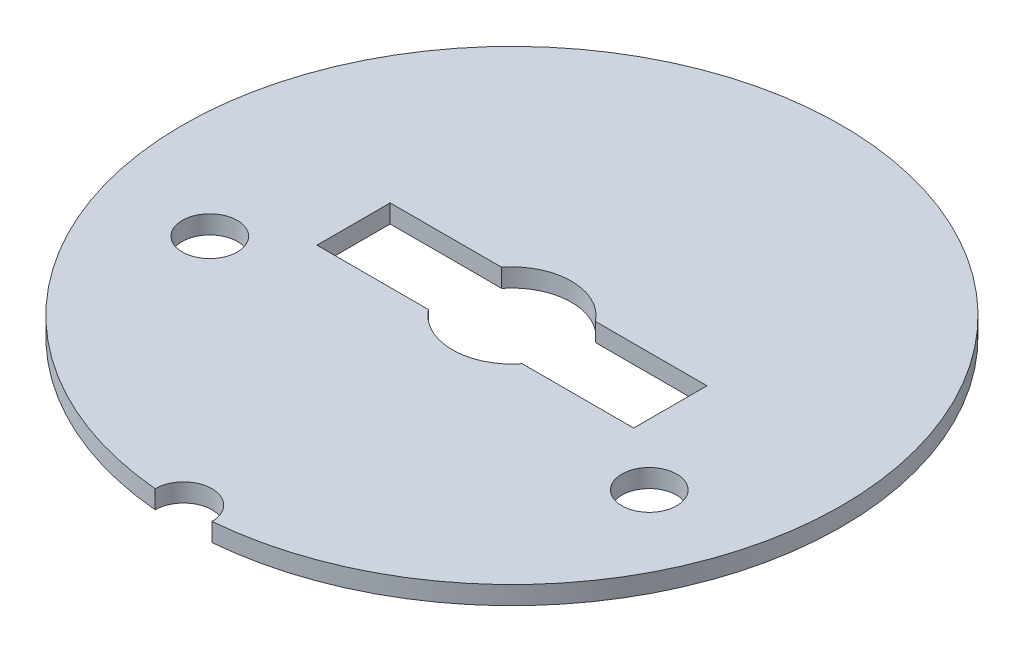
ISO-10303-21;
HEADER;
FILE_DESCRIPTION(('STEP AP214'),'2;1');
FILE_NAME('part.step','',(''),(''),'','','');
FILE_SCHEMA(('AUTOMOTIVE_DESIGN { 1 0 10303 214 1 1 1 1 }'));
ENDSEC;
DATA;
#1=APPLICATION_CONTEXT('core data for automotive mechanical design processes');
#2=APPLICATION_PROTOCOL_DEFINITION('international standard','automotive_design',2000,#1);
#3=PRODUCT_CONTEXT('',#1,'mechanical');
#4=PRODUCT('Part','Part','',(#3));
#5=PRODUCT_RELATED_PRODUCT_CATEGORY('part','',(#4));
#6=PRODUCT_DEFINITION_FORMATION('','',#4);
#7=PRODUCT_DEFINITION_CONTEXT('part definition',#1,'design');
#8=PRODUCT_DEFINITION('design','',#6,#7);
#9=PRODUCT_DEFINITION_SHAPE('','',#8);
#10=(LENGTH_UNIT() NAMED_UNIT(*) SI_UNIT(.MILLI.,.METRE.));
#11=(NAMED_UNIT(*) PLANE_ANGLE_UNIT() SI_UNIT($,.RADIAN.));
#12=(NAMED_UNIT(*) SI_UNIT($,.STERADIAN.) SOLID_ANGLE_UNIT());
#13=UNCERTAINTY_MEASURE_WITH_UNIT(LENGTH_MEASURE(1.E-05),#10,'distance_accuracy_value','');
#14=(GEOMETRIC_REPRESENTATION_CONTEXT(3) GLOBAL_UNCERTAINTY_ASSIGNED_CONTEXT((#13)) GLOBAL_UNIT_ASSIGNED_CONTEXT((#10,
#11,#12)) REPRESENTATION_CONTEXT('',''));
#15=CARTESIAN_POINT('',(0.,0.,0.));
#16=DIRECTION('',(0.,0.,1.));
#17=DIRECTION('',(1.,0.,0.));
#18=AXIS2_PLACEMENT_3D('',#15,#16,#17);
#19=CARTESIAN_POINT('',(0.,20.32,22.7750874367147));
#20=DIRECTION('',(0.,1.,0.));
#21=DIRECTION('',(0.,0.,1.));
#22=AXIS2_PLACEMENT_3D('',#19,#20,#21);
#23=PLANE('',#22);
#24=CARTESIAN_POINT('',(-30.48,20.32,11.43));
#25=DIRECTION('',(0.,1.,0.));
#26=DIRECTION('',(0.,0.,1.));
#27=AXIS2_PLACEMENT_3D('',#24,#25,#26);
#28=CIRCLE('',#27,3.81);
#29=CARTESIAN_POINT('',(-30.48,20.32,15.24));
#30=VERTEX_POINT('',#29);
#31=EDGE_CURVE('E130',#30,#30,#28,.F.);
#32=ORIENTED_EDGE('',*,*,#31,.T.);
#33=EDGE_LOOP('',(#32));
#34=FACE_BOUND('',#33,.T.);
#35=CARTESIAN_POINT('',(30.48,20.32,11.43));
#36=DIRECTION('',(0.,1.,0.));
#37=DIRECTION('',(0.,0.,1.));
#38=AXIS2_PLACEMENT_3D('',#35,#36,#37);
#39=CIRCLE('',#38,3.81);
#40=CARTESIAN_POINT('',(30.48,20.32,15.24));
#41=VERTEX_POINT('',#40);
#42=EDGE_CURVE('E153',#41,#41,#39,.F.);
#43=ORIENTED_EDGE('',*,*,#42,.T.);
#44=EDGE_LOOP('',(#43));
#45=FACE_BOUND('',#44,.T.);
#46=CARTESIAN_POINT('',(0.,20.32,45.5501748734294));
#47=DIRECTION('',(0.,-1.,0.));
#48=DIRECTION('',(0.,0.,1.));
#49=AXIS2_PLACEMENT_3D('',#46,#47,#48);
#50=CIRCLE('',#49,3.937);
#51=CARTESIAN_POINT('',(-3.93700000000001,20.32,45.5501748734294));
#52=VERTEX_POINT('',#51);
#53=CARTESIAN_POINT('',(3.937,20.32,45.5501748734294));
#54=VERTEX_POINT('',#53);
#55=EDGE_CURVE('E197',#52,#54,#50,.T.);
#56=ORIENTED_EDGE('',*,*,#55,.T.);
#57=CARTESIAN_POINT('',(0.,20.32,0.));
#58=DIRECTION('',(0.,1.,0.));
#59=DIRECTION('',(0.,0.,1.));
#60=AXIS2_PLACEMENT_3D('',#57,#58,#59);
#61=CIRCLE('',#60,45.72);
#62=EDGE_CURVE('E133',#54,#52,#61,.T.);
#63=ORIENTED_EDGE('',*,*,#62,.T.);
#64=EDGE_LOOP('',(#56,#63));
#65=FACE_BOUND('',#64,.T.);
#66=CARTESIAN_POINT('',(0.,20.32,0.));
#67=DIRECTION('',(0.,1.,0.));
#68=DIRECTION('',(0.,0.,1.));
#69=AXIS2_PLACEMENT_3D('',#66,#67,#68);
#70=CIRCLE('',#69,8.255);
#71=CARTESIAN_POINT('',(-6.50681373638434,20.32,-5.08));
#72=VERTEX_POINT('',#71);
#73=CARTESIAN_POINT('',(6.50681373638434,20.32,-5.08));
#74=VERTEX_POINT('',#73);
#75=EDGE_CURVE('E145',#72,#74,#70,.F.);
#76=ORIENTED_EDGE('',*,*,#75,.T.);
#77=DIRECTION('',(1.,0.,0.));
#78=VECTOR('',#77,1.);
#79=CARTESIAN_POINT('',(0.,20.32,-5.08));
#80=LINE('',#79,#78);
#81=CARTESIAN_POINT('',(21.971,20.32,-5.08));
#82=VERTEX_POINT('',#81);
#83=EDGE_CURVE('E188',#74,#82,#80,.T.);
#84=ORIENTED_EDGE('',*,*,#83,.T.);
#85=DIRECTION('',(0.,0.,1.));
#86=VECTOR('',#85,1.);
#87=CARTESIAN_POINT('',(21.971,20.32,22.7750874367147));
#88=LINE('',#87,#86);
#89=CARTESIAN_POINT('',(21.971,20.32,5.08));
#90=VERTEX_POINT('',#89);
#91=EDGE_CURVE('E148',#82,#90,#88,.T.);
#92=ORIENTED_EDGE('',*,*,#91,.T.);
#93=DIRECTION('',(-1.,0.,0.));
#94=VECTOR('',#93,1.);
#95=CARTESIAN_POINT('',(0.,20.32,5.08));
#96=LINE('',#95,#94);
#97=CARTESIAN_POINT('',(6.50681373638434,20.32,5.08));
#98=VERTEX_POINT('',#97);
#99=EDGE_CURVE('E179',#90,#98,#96,.T.);
#100=ORIENTED_EDGE('',*,*,#99,.T.);
#101=CARTESIAN_POINT('',(-6.50681373638434,20.32,5.08));
#102=VERTEX_POINT('',#101);
#103=EDGE_CURVE('E123',#98,#102,#70,.F.);
#104=ORIENTED_EDGE('',*,*,#103,.T.);
#105=CARTESIAN_POINT('',(-21.971,20.32,5.08));
#106=VERTEX_POINT('',#105);
#107=EDGE_CURVE('E175',#102,#106,#96,.T.);
#108=ORIENTED_EDGE('',*,*,#107,.T.);
#109=DIRECTION('',(0.,0.,-1.));
#110=VECTOR('',#109,1.);
#111=CARTESIAN_POINT('',(-21.971,20.32,22.7750874367147));
#112=LINE('',#111,#110);
#113=CARTESIAN_POINT('',(-21.971,20.32,-5.08));
#114=VERTEX_POINT('',#113);
#115=EDGE_CURVE('E182',#106,#114,#112,.T.);
#116=ORIENTED_EDGE('',*,*,#115,.T.);
#117=EDGE_CURVE('E192',#114,#72,#80,.T.);
#118=ORIENTED_EDGE('',*,*,#117,.T.);
#119=EDGE_LOOP('',(#76,#84,#92,#100,#104,#108,#116,#118));
#120=FACE_BOUND('',#119,.T.);
#121=ADVANCED_FACE('F35',(#34,#45,#65,#120),#23,.T.);
#122=CARTESIAN_POINT('',(21.971,38.608,5.08));
#123=DIRECTION('',(-1.,0.,0.));
#124=DIRECTION('',(0.,0.,1.));
#125=AXIS2_PLACEMENT_3D('',#122,#123,#124);
#126=PLANE('',#125);
#127=DIRECTION('',(0.,-1.,0.));
#128=VECTOR('',#127,1.);
#129=CARTESIAN_POINT('',(21.971,38.608,-5.08));
#130=LINE('',#129,#128);
#131=CARTESIAN_POINT('',(21.971,17.78,-5.08));
#132=VERTEX_POINT('',#131);
#133=EDGE_CURVE('E171',#82,#132,#130,.T.);
#134=ORIENTED_EDGE('',*,*,#133,.T.);
#135=DIRECTION('',(0.,0.,1.));
#136=VECTOR('',#135,1.);
#137=CARTESIAN_POINT('',(21.971,17.78,0.));
#138=LINE('',#137,#136);
#139=CARTESIAN_POINT('',(21.971,17.78,5.08));
#140=VERTEX_POINT('',#139);
#141=EDGE_CURVE('E44',#132,#140,#138,.T.);
#142=ORIENTED_EDGE('',*,*,#141,.T.);
#143=DIRECTION('',(0.,-1.,0.));
#144=VECTOR('',#143,1.);
#145=CARTESIAN_POINT('',(21.971,38.608,5.08));
#146=LINE('',#145,#144);
#147=EDGE_CURVE('E53',#90,#140,#146,.T.);
#148=ORIENTED_EDGE('',*,*,#147,.F.);
#149=ORIENTED_EDGE('',*,*,#91,.F.);
#150=EDGE_LOOP('',(#134,#142,#148,#149));
#151=FACE_BOUND('',#150,.T.);
#152=ADVANCED_FACE('F201',(#151),#126,.T.);
#153=CARTESIAN_POINT('',(-21.971,38.608,5.08));
#154=DIRECTION('',(0.,0.,-1.));
#155=DIRECTION('',(-1.,0.,0.));
#156=AXIS2_PLACEMENT_3D('',#153,#154,#155);
#157=PLANE('',#156);
#158=ORIENTED_EDGE('',*,*,#147,.T.);
#159=DIRECTION('',(-1.,0.,0.));
#160=VECTOR('',#159,1.);
#161=CARTESIAN_POINT('',(0.,17.78,5.08));
#162=LINE('',#161,#160);
#163=CARTESIAN_POINT('',(6.50681373638435,17.78,5.08));
#164=VERTEX_POINT('',#163);
#165=EDGE_CURVE('E139',#140,#164,#162,.T.);
#166=ORIENTED_EDGE('',*,*,#165,.T.);
#167=DIRECTION('',(0.,-1.,0.));
#168=VECTOR('',#167,1.);
#169=CARTESIAN_POINT('',(6.50681373638434,50.038,5.08));
#170=LINE('',#169,#168);
#171=EDGE_CURVE('E178',#98,#164,#170,.T.);
#172=ORIENTED_EDGE('',*,*,#171,.F.);
#173=ORIENTED_EDGE('',*,*,#99,.F.);
#174=EDGE_LOOP('',(#158,#166,#172,#173));
#175=FACE_BOUND('',#174,.T.);
#176=ADVANCED_FACE('F251',(#175),#157,.T.);
#177=CARTESIAN_POINT('',(0.,50.038,0.));
#178=DIRECTION('',(0.,-1.,0.));
#179=DIRECTION('',(0.,0.,-1.));
#180=AXIS2_PLACEMENT_3D('',#177,#178,#179);
#181=CYLINDRICAL_SURFACE('',#180,8.255);
#182=ORIENTED_EDGE('',*,*,#103,.F.);
#183=ORIENTED_EDGE('',*,*,#171,.T.);
#184=CARTESIAN_POINT('',(0.,17.78,0.));
#185=DIRECTION('',(0.,1.,0.));
#186=DIRECTION('',(0.,0.,1.));
#187=AXIS2_PLACEMENT_3D('',#184,#185,#186);
#188=CIRCLE('',#187,8.255);
#189=CARTESIAN_POINT('',(-6.50681373638435,17.78,5.08));
#190=VERTEX_POINT('',#189);
#191=EDGE_CURVE('E146',#190,#164,#188,.T.);
#192=ORIENTED_EDGE('',*,*,#191,.F.);
#193=DIRECTION('',(0.,-1.,0.));
#194=VECTOR('',#193,1.);
#195=CARTESIAN_POINT('',(-6.50681373638434,50.038,5.08));
#196=LINE('',#195,#194);
#197=EDGE_CURVE('E61',#190,#102,#196,.F.);
#198=ORIENTED_EDGE('',*,*,#197,.T.);
#199=EDGE_LOOP('',(#182,#183,#192,#198));
#200=FACE_BOUND('',#199,.T.);
#201=ADVANCED_FACE('F222',(#200),#181,.F.);
#202=ORIENTED_EDGE('',*,*,#197,.F.);
#203=CARTESIAN_POINT('',(-21.971,17.78,5.08));
#204=VERTEX_POINT('',#203);
#205=EDGE_CURVE('E135',#190,#204,#162,.T.);
#206=ORIENTED_EDGE('',*,*,#205,.T.);
#207=DIRECTION('',(0.,-1.,0.));
#208=VECTOR('',#207,1.);
#209=CARTESIAN_POINT('',(-21.971,38.608,5.08));
#210=LINE('',#209,#208);
#211=EDGE_CURVE('E165',#106,#204,#210,.T.);
#212=ORIENTED_EDGE('',*,*,#211,.F.);
#213=ORIENTED_EDGE('',*,*,#107,.F.);
#214=EDGE_LOOP('',(#202,#206,#212,#213));
#215=FACE_BOUND('',#214,.T.);
#216=ADVANCED_FACE('F226',(#215),#157,.T.);
#217=CARTESIAN_POINT('',(-21.971,38.608,5.08));
#218=DIRECTION('',(1.,0.,0.));
#219=DIRECTION('',(0.,0.,-1.));
#220=AXIS2_PLACEMENT_3D('',#217,#218,#219);
#221=PLANE('',#220);
#222=ORIENTED_EDGE('',*,*,#211,.T.);
#223=DIRECTION('',(0.,0.,-1.));
#224=VECTOR('',#223,1.);
#225=CARTESIAN_POINT('',(-21.971,17.78,0.));
#226=LINE('',#225,#224);
#227=CARTESIAN_POINT('',(-21.971,17.78,-5.08));
#228=VERTEX_POINT('',#227);
#229=EDGE_CURVE('E137',#204,#228,#226,.T.);
#230=ORIENTED_EDGE('',*,*,#229,.T.);
#231=DIRECTION('',(0.,-1.,0.));
#232=VECTOR('',#231,1.);
#233=CARTESIAN_POINT('',(-21.971,38.608,-5.08));
#234=LINE('',#233,#232);
#235=EDGE_CURVE('E168',#114,#228,#234,.T.);
#236=ORIENTED_EDGE('',*,*,#235,.F.);
#237=ORIENTED_EDGE('',*,*,#115,.F.);
#238=EDGE_LOOP('',(#222,#230,#236,#237));
#239=FACE_BOUND('',#238,.T.);
#240=ADVANCED_FACE('F228',(#239),#221,.T.);
#241=CARTESIAN_POINT('',(-21.971,38.608,-5.08));
#242=DIRECTION('',(0.,0.,1.));
#243=DIRECTION('',(1.,0.,0.));
#244=AXIS2_PLACEMENT_3D('',#241,#242,#243);
#245=PLANE('',#244);
#246=ORIENTED_EDGE('',*,*,#235,.T.);
#247=DIRECTION('',(1.,0.,0.));
#248=VECTOR('',#247,1.);
#249=CARTESIAN_POINT('',(0.,17.78,-5.08));
#250=LINE('',#249,#248);
#251=CARTESIAN_POINT('',(-6.50681373638434,17.78,-5.08));
#252=VERTEX_POINT('',#251);
#253=EDGE_CURVE('E46',#228,#252,#250,.T.);
#254=ORIENTED_EDGE('',*,*,#253,.T.);
#255=DIRECTION('',(0.,-1.,0.));
#256=VECTOR('',#255,1.);
#257=CARTESIAN_POINT('',(-6.50681373638434,50.038,-5.08));
#258=LINE('',#257,#256);
#259=EDGE_CURVE('E191',#72,#252,#258,.T.);
#260=ORIENTED_EDGE('',*,*,#259,.F.);
#261=ORIENTED_EDGE('',*,*,#117,.F.);
#262=EDGE_LOOP('',(#246,#254,#260,#261));
#263=FACE_BOUND('',#262,.T.);
#264=ADVANCED_FACE('F231',(#263),#245,.T.);
#265=ORIENTED_EDGE('',*,*,#75,.F.);
#266=ORIENTED_EDGE('',*,*,#259,.T.);
#267=CARTESIAN_POINT('',(6.50681373638434,17.78,-5.08));
#268=VERTEX_POINT('',#267);
#269=EDGE_CURVE('E124',#268,#252,#188,.T.);
#270=ORIENTED_EDGE('',*,*,#269,.F.);
#271=DIRECTION('',(0.,-1.,0.));
#272=VECTOR('',#271,1.);
#273=CARTESIAN_POINT('',(6.50681373638434,50.038,-5.08));
#274=LINE('',#273,#272);
#275=EDGE_CURVE('E185',#268,#74,#274,.F.);
#276=ORIENTED_EDGE('',*,*,#275,.T.);
#277=EDGE_LOOP('',(#265,#266,#270,#276));
#278=FACE_BOUND('',#277,.T.);
#279=ADVANCED_FACE('F208',(#278),#181,.F.);
#280=ORIENTED_EDGE('',*,*,#275,.F.);
#281=EDGE_CURVE('E11',#268,#132,#250,.T.);
#282=ORIENTED_EDGE('',*,*,#281,.T.);
#283=ORIENTED_EDGE('',*,*,#133,.F.);
#284=ORIENTED_EDGE('',*,*,#83,.F.);
#285=EDGE_LOOP('',(#280,#282,#283,#284));
#286=FACE_BOUND('',#285,.T.);
#287=ADVANCED_FACE('F213',(#286),#245,.T.);
#288=CARTESIAN_POINT('',(0.,20.32,0.));
#289=DIRECTION('',(0.,-1.,0.));
#290=DIRECTION('',(0.,0.,-1.));
#291=AXIS2_PLACEMENT_3D('',#288,#289,#290);
#292=CYLINDRICAL_SURFACE('',#291,45.72);
#293=CARTESIAN_POINT('',(0.,17.78,0.));
#294=DIRECTION('',(0.,-1.,0.));
#295=DIRECTION('',(0.,0.,-1.));
#296=AXIS2_PLACEMENT_3D('',#293,#294,#295);
#297=CIRCLE('',#296,45.72);
#298=CARTESIAN_POINT('',(-3.937,17.78,45.5501748734294));
#299=VERTEX_POINT('',#298);
#300=CARTESIAN_POINT('',(3.937,17.78,45.5501748734294));
#301=VERTEX_POINT('',#300);
#302=EDGE_CURVE('E126',#299,#301,#297,.T.);
#303=ORIENTED_EDGE('',*,*,#302,.F.);
#304=DIRECTION('',(0.,-1.,0.));
#305=VECTOR('',#304,1.);
#306=CARTESIAN_POINT('',(-3.93700000000001,20.32,45.5501748734294));
#307=LINE('',#306,#305);
#308=EDGE_CURVE('E120',#52,#299,#307,.T.);
#309=ORIENTED_EDGE('',*,*,#308,.F.);
#310=ORIENTED_EDGE('',*,*,#62,.F.);
#311=DIRECTION('',(0.,-1.,0.));
#312=VECTOR('',#311,1.);
#313=CARTESIAN_POINT('',(3.937,20.32,45.5501748734294));
#314=LINE('',#313,#312);
#315=EDGE_CURVE('E118',#54,#301,#314,.T.);
#316=ORIENTED_EDGE('',*,*,#315,.T.);
#317=EDGE_LOOP('',(#303,#309,#310,#316));
#318=FACE_BOUND('',#317,.T.);
#319=ADVANCED_FACE('F132',(#318),#292,.T.);
#320=CARTESIAN_POINT('',(0.,17.78,0.));
#321=DIRECTION('',(0.,1.,0.));
#322=DIRECTION('',(0.,0.,1.));
#323=AXIS2_PLACEMENT_3D('',#320,#321,#322);
#324=PLANE('',#323);
#325=CARTESIAN_POINT('',(-30.48,17.78,11.43));
#326=DIRECTION('',(0.,1.,0.));
#327=DIRECTION('',(0.,0.,1.));
#328=AXIS2_PLACEMENT_3D('',#325,#326,#327);
#329=CIRCLE('',#328,3.81);
#330=CARTESIAN_POINT('',(-30.48,17.78,15.24));
#331=VERTEX_POINT('',#330);
#332=EDGE_CURVE('E39',#331,#331,#329,.F.);
#333=ORIENTED_EDGE('',*,*,#332,.F.);
#334=EDGE_LOOP('',(#333));
#335=FACE_BOUND('',#334,.T.);
#336=CARTESIAN_POINT('',(30.48,17.78,11.43));
#337=DIRECTION('',(0.,1.,0.));
#338=DIRECTION('',(0.,0.,1.));
#339=AXIS2_PLACEMENT_3D('',#336,#337,#338);
#340=CIRCLE('',#339,3.81);
#341=CARTESIAN_POINT('',(30.48,17.78,15.24));
#342=VERTEX_POINT('',#341);
#343=EDGE_CURVE('E151',#342,#342,#340,.F.);
#344=ORIENTED_EDGE('',*,*,#343,.F.);
#345=EDGE_LOOP('',(#344));
#346=FACE_BOUND('',#345,.T.);
#347=CARTESIAN_POINT('',(0.,17.78,45.5501748734294));
#348=DIRECTION('',(0.,1.,0.));
#349=DIRECTION('',(0.,0.,1.));
#350=AXIS2_PLACEMENT_3D('',#347,#348,#349);
#351=CIRCLE('',#350,3.937);
#352=EDGE_CURVE('E114',#299,#301,#351,.F.);
#353=ORIENTED_EDGE('',*,*,#352,.F.);
#354=ORIENTED_EDGE('',*,*,#302,.T.);
#355=EDGE_LOOP('',(#353,#354));
#356=FACE_BOUND('',#355,.T.);
#357=ORIENTED_EDGE('',*,*,#281,.F.);
#358=ORIENTED_EDGE('',*,*,#269,.T.);
#359=ORIENTED_EDGE('',*,*,#253,.F.);
#360=ORIENTED_EDGE('',*,*,#229,.F.);
#361=ORIENTED_EDGE('',*,*,#205,.F.);
#362=ORIENTED_EDGE('',*,*,#191,.T.);
#363=ORIENTED_EDGE('',*,*,#165,.F.);
#364=ORIENTED_EDGE('',*,*,#141,.F.);
#365=EDGE_LOOP('',(#357,#358,#359,#360,#361,#362,#363,#364));
#366=FACE_BOUND('',#365,.T.);
#367=ADVANCED_FACE('F127',(#335,#346,#356,#366),#324,.F.);
#368=CARTESIAN_POINT('',(0.,20.32,45.5501748734294));
#369=DIRECTION('',(0.,-1.,0.));
#370=DIRECTION('',(0.,0.,-1.));
#371=AXIS2_PLACEMENT_3D('',#368,#369,#370);
#372=CYLINDRICAL_SURFACE('',#371,3.937);
#373=ORIENTED_EDGE('',*,*,#308,.T.);
#374=ORIENTED_EDGE('',*,*,#352,.T.);
#375=ORIENTED_EDGE('',*,*,#315,.F.);
#376=ORIENTED_EDGE('',*,*,#55,.F.);
#377=EDGE_LOOP('',(#373,#374,#375,#376));
#378=FACE_BOUND('',#377,.T.);
#379=ADVANCED_FACE('F37',(#378),#372,.F.);
#380=CARTESIAN_POINT('',(30.48,39.37,11.43));
#381=DIRECTION('',(0.,-1.,0.));
#382=DIRECTION('',(0.,0.,-1.));
#383=AXIS2_PLACEMENT_3D('',#380,#381,#382);
#384=CYLINDRICAL_SURFACE('',#383,3.81);
#385=ORIENTED_EDGE('',*,*,#42,.F.);
#386=EDGE_LOOP('',(#385));
#387=FACE_BOUND('',#386,.T.);
#388=ORIENTED_EDGE('',*,*,#343,.T.);
#389=EDGE_LOOP('',(#388));
#390=FACE_BOUND('',#389,.T.);
#391=ADVANCED_FACE('F311',(#387,#390),#384,.F.);
#392=CARTESIAN_POINT('',(-30.48,39.37,11.43));
#393=DIRECTION('',(0.,-1.,0.));
#394=DIRECTION('',(0.,0.,-1.));
#395=AXIS2_PLACEMENT_3D('',#392,#393,#394);
#396=CYLINDRICAL_SURFACE('',#395,3.81);
#397=ORIENTED_EDGE('',*,*,#31,.F.);
#398=EDGE_LOOP('',(#397));
#399=FACE_BOUND('',#398,.T.);
#400=ORIENTED_EDGE('',*,*,#332,.T.);
#401=EDGE_LOOP('',(#400));
#402=FACE_BOUND('',#401,.T.);
#403=ADVANCED_FACE('F318',(#399,#402),#396,.F.);
#404=CLOSED_SHELL('',(#121,#152,#176,#201,#216,#240,#264,#279,#287,#319,#367,#379,#391,#403));
#405=MANIFOLD_SOLID_BREP('B2',#404);
#406=ADVANCED_BREP_SHAPE_REPRESENTATION('',(#18,#405),#14);
#407=SHAPE_DEFINITION_REPRESENTATION(#9,#406);
ENDSEC;
END-ISO-10303-21;
